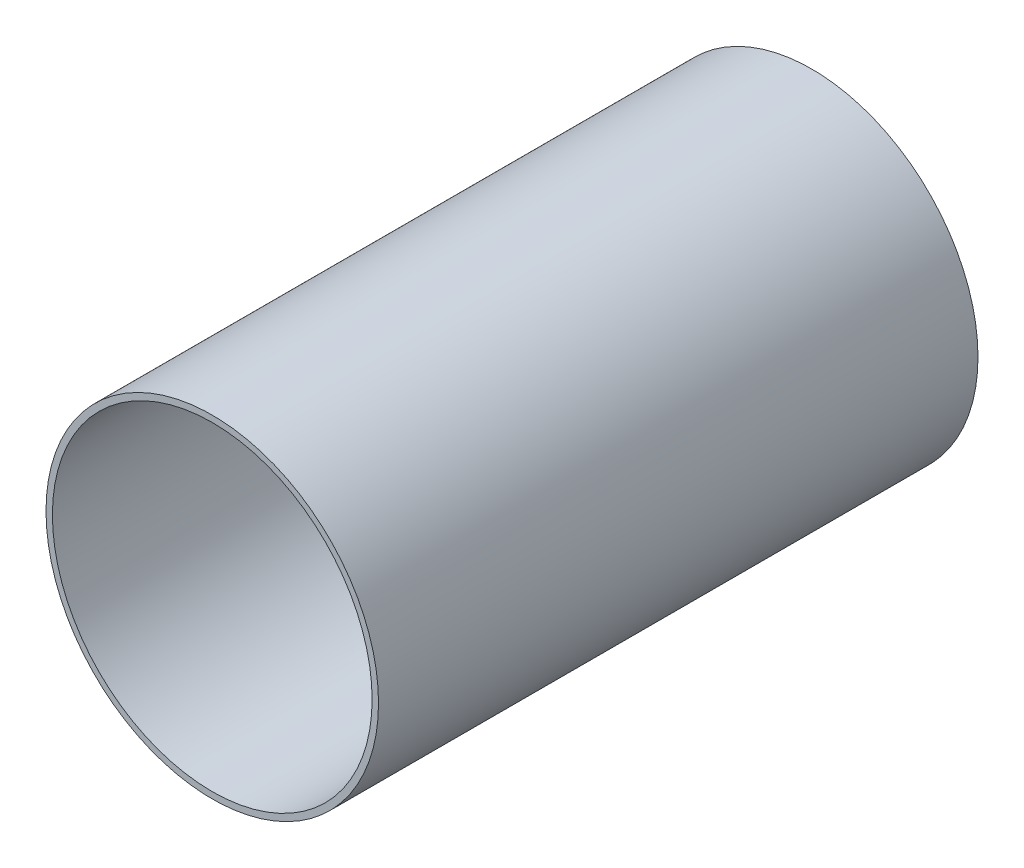
ISO-10303-21;
HEADER;
FILE_DESCRIPTION(('STEP AP214'),'2;1');
FILE_NAME('part.step','',(''),(''),'','','');
FILE_SCHEMA(('AUTOMOTIVE_DESIGN { 1 0 10303 214 1 1 1 1 }'));
ENDSEC;
DATA;
#1=APPLICATION_CONTEXT('core data for automotive mechanical design processes');
#2=APPLICATION_PROTOCOL_DEFINITION('international standard','automotive_design',2000,#1);
#3=PRODUCT_CONTEXT('',#1,'mechanical');
#4=PRODUCT('Part','Part','',(#3));
#5=PRODUCT_RELATED_PRODUCT_CATEGORY('part','',(#4));
#6=PRODUCT_DEFINITION_FORMATION('','',#4);
#7=PRODUCT_DEFINITION_CONTEXT('part definition',#1,'design');
#8=PRODUCT_DEFINITION('design','',#6,#7);
#9=PRODUCT_DEFINITION_SHAPE('','',#8);
#10=(LENGTH_UNIT() NAMED_UNIT(*) SI_UNIT(.MILLI.,.METRE.));
#11=(NAMED_UNIT(*) PLANE_ANGLE_UNIT() SI_UNIT($,.RADIAN.));
#12=(NAMED_UNIT(*) SI_UNIT($,.STERADIAN.) SOLID_ANGLE_UNIT());
#13=UNCERTAINTY_MEASURE_WITH_UNIT(LENGTH_MEASURE(1.E-05),#10,'distance_accuracy_value','');
#14=(GEOMETRIC_REPRESENTATION_CONTEXT(3) GLOBAL_UNCERTAINTY_ASSIGNED_CONTEXT((#13)) GLOBAL_UNIT_ASSIGNED_CONTEXT((#10,
#11,#12)) REPRESENTATION_CONTEXT('',''));
#15=CARTESIAN_POINT('',(0.,0.,0.));
#16=DIRECTION('',(0.,0.,1.));
#17=DIRECTION('',(1.,0.,0.));
#18=AXIS2_PLACEMENT_3D('',#15,#16,#17);
#19=CARTESIAN_POINT('',(0.,0.,1.5));
#20=DIRECTION('',(0.,0.,1.));
#21=DIRECTION('',(1.,0.,0.));
#22=AXIS2_PLACEMENT_3D('',#19,#20,#21);
#23=PLANE('',#22);
#24=CARTESIAN_POINT('',(0.,0.,1.5));
#25=DIRECTION('',(0.,0.,1.));
#26=DIRECTION('',(1.,0.,0.));
#27=AXIS2_PLACEMENT_3D('',#24,#25,#26);
#28=CIRCLE('',#27,0.416);
#29=CARTESIAN_POINT('',(0.416,0.,1.5));
#30=VERTEX_POINT('',#29);
#31=EDGE_CURVE('E10',#30,#30,#28,.T.);
#32=ORIENTED_EDGE('',*,*,#31,.T.);
#33=EDGE_LOOP('',(#32));
#34=FACE_BOUND('',#33,.T.);
#35=CARTESIAN_POINT('',(0.,0.,1.5));
#36=DIRECTION('',(0.,0.,1.));
#37=DIRECTION('',(1.,0.,0.));
#38=AXIS2_PLACEMENT_3D('',#35,#36,#37);
#39=CIRCLE('',#38,0.4);
#40=CARTESIAN_POINT('',(0.4,0.,1.5));
#41=VERTEX_POINT('',#40);
#42=EDGE_CURVE('E42',#41,#41,#39,.T.);
#43=ORIENTED_EDGE('',*,*,#42,.F.);
#44=EDGE_LOOP('',(#43));
#45=FACE_BOUND('',#44,.T.);
#46=ADVANCED_FACE('F31',(#34,#45),#23,.T.);
#47=CARTESIAN_POINT('',(0.,0.,0.));
#48=DIRECTION('',(0.,0.,1.));
#49=DIRECTION('',(1.,0.,0.));
#50=AXIS2_PLACEMENT_3D('',#47,#48,#49);
#51=PLANE('',#50);
#52=CARTESIAN_POINT('',(0.,0.,0.));
#53=DIRECTION('',(0.,0.,1.));
#54=DIRECTION('',(1.,0.,0.));
#55=AXIS2_PLACEMENT_3D('',#52,#53,#54);
#56=CIRCLE('',#55,0.416);
#57=CARTESIAN_POINT('',(0.416,0.,0.));
#58=VERTEX_POINT('',#57);
#59=EDGE_CURVE('E35',#58,#58,#56,.T.);
#60=ORIENTED_EDGE('',*,*,#59,.F.);
#61=EDGE_LOOP('',(#60));
#62=FACE_BOUND('',#61,.T.);
#63=CARTESIAN_POINT('',(0.,0.,0.));
#64=DIRECTION('',(0.,0.,1.));
#65=DIRECTION('',(1.,0.,0.));
#66=AXIS2_PLACEMENT_3D('',#63,#64,#65);
#67=CIRCLE('',#66,0.4);
#68=CARTESIAN_POINT('',(0.4,0.,0.));
#69=VERTEX_POINT('',#68);
#70=EDGE_CURVE('E44',#69,#69,#67,.T.);
#71=ORIENTED_EDGE('',*,*,#70,.T.);
#72=EDGE_LOOP('',(#71));
#73=FACE_BOUND('',#72,.T.);
#74=ADVANCED_FACE('F54',(#62,#73),#51,.F.);
#75=CARTESIAN_POINT('',(0.,0.,1.5));
#76=DIRECTION('',(0.,0.,-1.));
#77=DIRECTION('',(-1.,0.,0.));
#78=AXIS2_PLACEMENT_3D('',#75,#76,#77);
#79=CYLINDRICAL_SURFACE('',#78,0.416);
#80=ORIENTED_EDGE('',*,*,#31,.F.);
#81=EDGE_LOOP('',(#80));
#82=FACE_BOUND('',#81,.T.);
#83=ORIENTED_EDGE('',*,*,#59,.T.);
#84=EDGE_LOOP('',(#83));
#85=FACE_BOUND('',#84,.T.);
#86=ADVANCED_FACE('F33',(#82,#85),#79,.T.);
#87=CARTESIAN_POINT('',(0.,0.,1.5));
#88=DIRECTION('',(0.,0.,-1.));
#89=DIRECTION('',(-1.,0.,0.));
#90=AXIS2_PLACEMENT_3D('',#87,#88,#89);
#91=CYLINDRICAL_SURFACE('',#90,0.4);
#92=ORIENTED_EDGE('',*,*,#42,.T.);
#93=EDGE_LOOP('',(#92));
#94=FACE_BOUND('',#93,.T.);
#95=ORIENTED_EDGE('',*,*,#70,.F.);
#96=EDGE_LOOP('',(#95));
#97=FACE_BOUND('',#96,.T.);
#98=ADVANCED_FACE('F50',(#94,#97),#91,.F.);
#99=CLOSED_SHELL('',(#46,#74,#86,#98));
#100=MANIFOLD_SOLID_BREP('B2',#99);
#101=ADVANCED_BREP_SHAPE_REPRESENTATION('',(#18,#100),#14);
#102=SHAPE_DEFINITION_REPRESENTATION(#9,#101);
ENDSEC;
END-ISO-10303-21;
